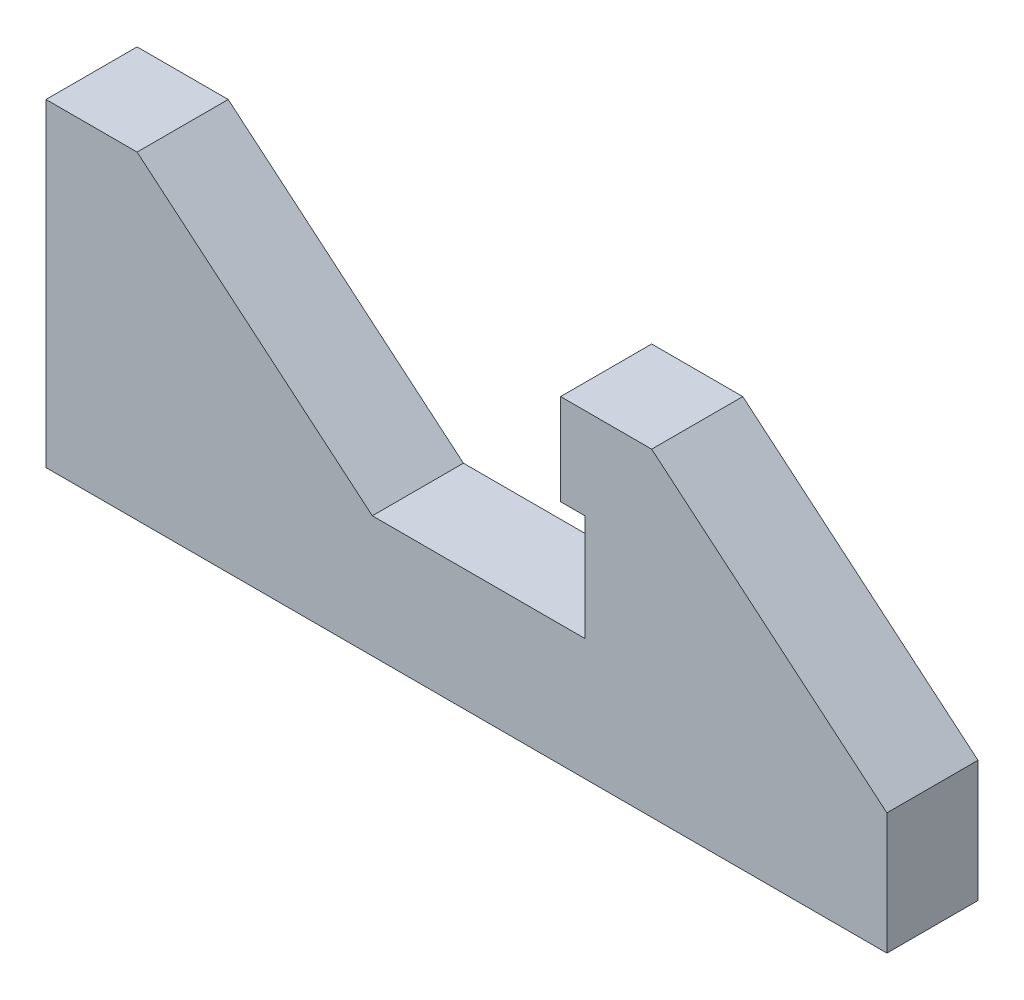
ISO-10303-21;
HEADER;
FILE_DESCRIPTION(('STEP AP214'),'2;1');
FILE_NAME('part.step','',(''),(''),'','','');
FILE_SCHEMA(('AUTOMOTIVE_DESIGN { 1 0 10303 214 1 1 1 1 }'));
ENDSEC;
DATA;
#1=APPLICATION_CONTEXT('core data for automotive mechanical design processes');
#2=APPLICATION_PROTOCOL_DEFINITION('international standard','automotive_design',2000,#1);
#3=PRODUCT_CONTEXT('',#1,'mechanical');
#4=PRODUCT('Part','Part','',(#3));
#5=PRODUCT_RELATED_PRODUCT_CATEGORY('part','',(#4));
#6=PRODUCT_DEFINITION_FORMATION('','',#4);
#7=PRODUCT_DEFINITION_CONTEXT('part definition',#1,'design');
#8=PRODUCT_DEFINITION('design','',#6,#7);
#9=PRODUCT_DEFINITION_SHAPE('','',#8);
#10=(LENGTH_UNIT() NAMED_UNIT(*) SI_UNIT(.MILLI.,.METRE.));
#11=(NAMED_UNIT(*) PLANE_ANGLE_UNIT() SI_UNIT($,.RADIAN.));
#12=(NAMED_UNIT(*) SI_UNIT($,.STERADIAN.) SOLID_ANGLE_UNIT());
#13=UNCERTAINTY_MEASURE_WITH_UNIT(LENGTH_MEASURE(1.E-05),#10,'distance_accuracy_value','');
#14=(GEOMETRIC_REPRESENTATION_CONTEXT(3) GLOBAL_UNCERTAINTY_ASSIGNED_CONTEXT((#13)) GLOBAL_UNIT_ASSIGNED_CONTEXT((#10,
#11,#12)) REPRESENTATION_CONTEXT('',''));
#15=CARTESIAN_POINT('',(0.,0.,0.));
#16=DIRECTION('',(0.,0.,1.));
#17=DIRECTION('',(1.,0.,0.));
#18=AXIS2_PLACEMENT_3D('',#15,#16,#17);
#19=CARTESIAN_POINT('',(276.927967037248,0.,30.));
#20=DIRECTION('',(0.,1.,0.));
#21=DIRECTION('',(-1.,0.,0.));
#22=AXIS2_PLACEMENT_3D('',#19,#20,#21);
#23=PLANE('',#22);
#24=DIRECTION('',(1.,0.,0.));
#25=VECTOR('',#24,1.);
#26=CARTESIAN_POINT('',(276.927967037248,0.,0.));
#27=LINE('',#26,#25);
#28=CARTESIAN_POINT('',(0.,0.,0.));
#29=VERTEX_POINT('',#28);
#30=CARTESIAN_POINT('',(276.927967037248,0.,0.));
#31=VERTEX_POINT('',#30);
#32=EDGE_CURVE('E147',#29,#31,#27,.T.);
#33=ORIENTED_EDGE('',*,*,#32,.T.);
#34=DIRECTION('',(0.,0.,-1.));
#35=VECTOR('',#34,1.);
#36=CARTESIAN_POINT('',(276.927967037248,0.,30.));
#37=LINE('',#36,#35);
#38=CARTESIAN_POINT('',(276.927967037248,0.,30.));
#39=VERTEX_POINT('',#38);
#40=EDGE_CURVE('E11',#39,#31,#37,.T.);
#41=ORIENTED_EDGE('',*,*,#40,.F.);
#42=DIRECTION('',(1.,0.,0.));
#43=VECTOR('',#42,1.);
#44=CARTESIAN_POINT('',(276.927967037248,0.,30.));
#45=LINE('',#44,#43);
#46=CARTESIAN_POINT('',(0.,0.,30.));
#47=VERTEX_POINT('',#46);
#48=EDGE_CURVE('E167',#47,#39,#45,.T.);
#49=ORIENTED_EDGE('',*,*,#48,.F.);
#50=DIRECTION('',(0.,0.,-1.));
#51=VECTOR('',#50,1.);
#52=CARTESIAN_POINT('',(0.,0.,30.));
#53=LINE('',#52,#51);
#54=EDGE_CURVE('E143',#47,#29,#53,.T.);
#55=ORIENTED_EDGE('',*,*,#54,.T.);
#56=EDGE_LOOP('',(#33,#41,#49,#55));
#57=FACE_BOUND('',#56,.T.);
#58=ADVANCED_FACE('F33',(#57),#23,.F.);
#59=CARTESIAN_POINT('',(276.927967037248,40.,30.));
#60=DIRECTION('',(-1.,0.,0.));
#61=DIRECTION('',(0.,0.,1.));
#62=AXIS2_PLACEMENT_3D('',#59,#60,#61);
#63=PLANE('',#62);
#64=DIRECTION('',(0.,1.,0.));
#65=VECTOR('',#64,1.);
#66=CARTESIAN_POINT('',(276.927967037248,40.,0.));
#67=LINE('',#66,#65);
#68=CARTESIAN_POINT('',(276.927967037248,40.,0.));
#69=VERTEX_POINT('',#68);
#70=EDGE_CURVE('E150',#31,#69,#67,.T.);
#71=ORIENTED_EDGE('',*,*,#70,.T.);
#72=DIRECTION('',(0.,0.,-1.));
#73=VECTOR('',#72,1.);
#74=CARTESIAN_POINT('',(276.927967037248,40.,30.));
#75=LINE('',#74,#73);
#76=CARTESIAN_POINT('',(276.927967037248,40.,30.));
#77=VERTEX_POINT('',#76);
#78=EDGE_CURVE('E41',#77,#69,#75,.T.);
#79=ORIENTED_EDGE('',*,*,#78,.F.);
#80=DIRECTION('',(0.,1.,0.));
#81=VECTOR('',#80,1.);
#82=CARTESIAN_POINT('',(276.927967037248,40.,30.));
#83=LINE('',#82,#81);
#84=EDGE_CURVE('E101',#39,#77,#83,.T.);
#85=ORIENTED_EDGE('',*,*,#84,.F.);
#86=ORIENTED_EDGE('',*,*,#40,.T.);
#87=EDGE_LOOP('',(#71,#79,#85,#86));
#88=FACE_BOUND('',#87,.T.);
#89=ADVANCED_FACE('F239',(#88),#63,.F.);
#90=CARTESIAN_POINT('',(199.463983518624,105.,30.));
#91=DIRECTION('',(-0.642787609686538,-0.766044443118979,0.));
#92=DIRECTION('',(0.766044443118979,-0.642787609686538,0.));
#93=AXIS2_PLACEMENT_3D('',#90,#91,#92);
#94=PLANE('',#93);
#95=DIRECTION('',(-0.766044443118979,0.642787609686538,0.));
#96=VECTOR('',#95,1.);
#97=CARTESIAN_POINT('',(199.463983518624,105.,0.));
#98=LINE('',#97,#96);
#99=CARTESIAN_POINT('',(199.463983518624,105.,0.));
#100=VERTEX_POINT('',#99);
#101=EDGE_CURVE('E152',#69,#100,#98,.T.);
#102=ORIENTED_EDGE('',*,*,#101,.T.);
#103=DIRECTION('',(0.,0.,-1.));
#104=VECTOR('',#103,1.);
#105=CARTESIAN_POINT('',(199.463983518624,105.,30.));
#106=LINE('',#105,#104);
#107=CARTESIAN_POINT('',(199.463983518624,105.,30.));
#108=VERTEX_POINT('',#107);
#109=EDGE_CURVE('E183',#108,#100,#106,.T.);
#110=ORIENTED_EDGE('',*,*,#109,.F.);
#111=DIRECTION('',(-0.766044443118979,0.642787609686538,0.));
#112=VECTOR('',#111,1.);
#113=CARTESIAN_POINT('',(199.463983518624,105.,30.));
#114=LINE('',#113,#112);
#115=EDGE_CURVE('E191',#77,#108,#114,.T.);
#116=ORIENTED_EDGE('',*,*,#115,.F.);
#117=ORIENTED_EDGE('',*,*,#78,.T.);
#118=EDGE_LOOP('',(#102,#110,#116,#117));
#119=FACE_BOUND('',#118,.T.);
#120=ADVANCED_FACE('F189',(#119),#94,.F.);
#121=CARTESIAN_POINT('',(169.463983518624,105.,30.));
#122=DIRECTION('',(0.,-1.,0.));
#123=DIRECTION('',(1.,0.,0.));
#124=AXIS2_PLACEMENT_3D('',#121,#122,#123);
#125=PLANE('',#124);
#126=DIRECTION('',(-1.,0.,0.));
#127=VECTOR('',#126,1.);
#128=CARTESIAN_POINT('',(169.463983518624,105.,0.));
#129=LINE('',#128,#127);
#130=CARTESIAN_POINT('',(169.463983518624,105.,0.));
#131=VERTEX_POINT('',#130);
#132=EDGE_CURVE('E154',#100,#131,#129,.T.);
#133=ORIENTED_EDGE('',*,*,#132,.T.);
#134=DIRECTION('',(0.,0.,-1.));
#135=VECTOR('',#134,1.);
#136=CARTESIAN_POINT('',(169.463983518624,105.,30.));
#137=LINE('',#136,#135);
#138=CARTESIAN_POINT('',(169.463983518624,105.,30.));
#139=VERTEX_POINT('',#138);
#140=EDGE_CURVE('E180',#139,#131,#137,.T.);
#141=ORIENTED_EDGE('',*,*,#140,.F.);
#142=DIRECTION('',(-1.,0.,0.));
#143=VECTOR('',#142,1.);
#144=CARTESIAN_POINT('',(169.463983518624,105.,30.));
#145=LINE('',#144,#143);
#146=EDGE_CURVE('E209',#108,#139,#145,.T.);
#147=ORIENTED_EDGE('',*,*,#146,.F.);
#148=ORIENTED_EDGE('',*,*,#109,.T.);
#149=EDGE_LOOP('',(#133,#141,#147,#148));
#150=FACE_BOUND('',#149,.T.);
#151=ADVANCED_FACE('F200',(#150),#125,.F.);
#152=CARTESIAN_POINT('',(169.463983518624,75.,30.));
#153=DIRECTION('',(1.,0.,0.));
#154=DIRECTION('',(0.,1.,0.));
#155=AXIS2_PLACEMENT_3D('',#152,#153,#154);
#156=PLANE('',#155);
#157=DIRECTION('',(0.,-1.,0.));
#158=VECTOR('',#157,1.);
#159=CARTESIAN_POINT('',(169.463983518624,75.,0.));
#160=LINE('',#159,#158);
#161=CARTESIAN_POINT('',(169.463983518624,75.,0.));
#162=VERTEX_POINT('',#161);
#163=EDGE_CURVE('E156',#131,#162,#160,.T.);
#164=ORIENTED_EDGE('',*,*,#163,.T.);
#165=DIRECTION('',(0.,0.,-1.));
#166=VECTOR('',#165,1.);
#167=CARTESIAN_POINT('',(169.463983518624,75.,30.));
#168=LINE('',#167,#166);
#169=CARTESIAN_POINT('',(169.463983518624,75.,30.));
#170=VERTEX_POINT('',#169);
#171=EDGE_CURVE('E177',#170,#162,#168,.T.);
#172=ORIENTED_EDGE('',*,*,#171,.F.);
#173=DIRECTION('',(0.,-1.,0.));
#174=VECTOR('',#173,1.);
#175=CARTESIAN_POINT('',(169.463983518624,75.,30.));
#176=LINE('',#175,#174);
#177=EDGE_CURVE('E206',#139,#170,#176,.T.);
#178=ORIENTED_EDGE('',*,*,#177,.F.);
#179=ORIENTED_EDGE('',*,*,#140,.T.);
#180=EDGE_LOOP('',(#164,#172,#178,#179));
#181=FACE_BOUND('',#180,.T.);
#182=ADVANCED_FACE('F204',(#181),#156,.F.);
#183=CARTESIAN_POINT('',(177.463983518624,75.,30.));
#184=DIRECTION('',(0.,1.,0.));
#185=DIRECTION('',(-1.,0.,0.));
#186=AXIS2_PLACEMENT_3D('',#183,#184,#185);
#187=PLANE('',#186);
#188=DIRECTION('',(1.,0.,0.));
#189=VECTOR('',#188,1.);
#190=CARTESIAN_POINT('',(177.463983518624,75.,0.));
#191=LINE('',#190,#189);
#192=CARTESIAN_POINT('',(177.463983518624,75.,0.));
#193=VERTEX_POINT('',#192);
#194=EDGE_CURVE('E158',#162,#193,#191,.T.);
#195=ORIENTED_EDGE('',*,*,#194,.T.);
#196=DIRECTION('',(0.,0.,-1.));
#197=VECTOR('',#196,1.);
#198=CARTESIAN_POINT('',(177.463983518624,75.,30.));
#199=LINE('',#198,#197);
#200=CARTESIAN_POINT('',(177.463983518624,75.,30.));
#201=VERTEX_POINT('',#200);
#202=EDGE_CURVE('E174',#201,#193,#199,.T.);
#203=ORIENTED_EDGE('',*,*,#202,.F.);
#204=DIRECTION('',(1.,0.,0.));
#205=VECTOR('',#204,1.);
#206=CARTESIAN_POINT('',(177.463983518624,75.,30.));
#207=LINE('',#206,#205);
#208=EDGE_CURVE('E208',#170,#201,#207,.T.);
#209=ORIENTED_EDGE('',*,*,#208,.F.);
#210=ORIENTED_EDGE('',*,*,#171,.T.);
#211=EDGE_LOOP('',(#195,#203,#209,#210));
#212=FACE_BOUND('',#211,.T.);
#213=ADVANCED_FACE('F252',(#212),#187,.F.);
#214=CARTESIAN_POINT('',(177.463983518624,40.,30.));
#215=DIRECTION('',(1.,0.,0.));
#216=DIRECTION('',(0.,1.,0.));
#217=AXIS2_PLACEMENT_3D('',#214,#215,#216);
#218=PLANE('',#217);
#219=DIRECTION('',(0.,-1.,0.));
#220=VECTOR('',#219,1.);
#221=CARTESIAN_POINT('',(177.463983518624,40.,0.));
#222=LINE('',#221,#220);
#223=CARTESIAN_POINT('',(177.463983518624,40.,0.));
#224=VERTEX_POINT('',#223);
#225=EDGE_CURVE('E160',#193,#224,#222,.T.);
#226=ORIENTED_EDGE('',*,*,#225,.T.);
#227=DIRECTION('',(0.,0.,-1.));
#228=VECTOR('',#227,1.);
#229=CARTESIAN_POINT('',(177.463983518624,40.,30.));
#230=LINE('',#229,#228);
#231=CARTESIAN_POINT('',(177.463983518624,40.,30.));
#232=VERTEX_POINT('',#231);
#233=EDGE_CURVE('E171',#232,#224,#230,.T.);
#234=ORIENTED_EDGE('',*,*,#233,.F.);
#235=DIRECTION('',(0.,-1.,0.));
#236=VECTOR('',#235,1.);
#237=CARTESIAN_POINT('',(177.463983518624,40.,30.));
#238=LINE('',#237,#236);
#239=EDGE_CURVE('E211',#201,#232,#238,.T.);
#240=ORIENTED_EDGE('',*,*,#239,.F.);
#241=ORIENTED_EDGE('',*,*,#202,.T.);
#242=EDGE_LOOP('',(#226,#234,#240,#241));
#243=FACE_BOUND('',#242,.T.);
#244=ADVANCED_FACE('F220',(#243),#218,.F.);
#245=CARTESIAN_POINT('',(107.463983518624,40.,30.));
#246=DIRECTION('',(0.,-1.,0.));
#247=DIRECTION('',(1.,0.,0.));
#248=AXIS2_PLACEMENT_3D('',#245,#246,#247);
#249=PLANE('',#248);
#250=DIRECTION('',(-1.,0.,0.));
#251=VECTOR('',#250,1.);
#252=CARTESIAN_POINT('',(107.463983518624,40.,0.));
#253=LINE('',#252,#251);
#254=CARTESIAN_POINT('',(107.463983518624,40.,0.));
#255=VERTEX_POINT('',#254);
#256=EDGE_CURVE('E162',#224,#255,#253,.T.);
#257=ORIENTED_EDGE('',*,*,#256,.T.);
#258=DIRECTION('',(0.,0.,-1.));
#259=VECTOR('',#258,1.);
#260=CARTESIAN_POINT('',(107.463983518624,40.,30.));
#261=LINE('',#260,#259);
#262=CARTESIAN_POINT('',(107.463983518624,40.,30.));
#263=VERTEX_POINT('',#262);
#264=EDGE_CURVE('E138',#263,#255,#261,.T.);
#265=ORIENTED_EDGE('',*,*,#264,.F.);
#266=DIRECTION('',(-1.,0.,0.));
#267=VECTOR('',#266,1.);
#268=CARTESIAN_POINT('',(107.463983518624,40.,30.));
#269=LINE('',#268,#267);
#270=EDGE_CURVE('E129',#232,#263,#269,.T.);
#271=ORIENTED_EDGE('',*,*,#270,.F.);
#272=ORIENTED_EDGE('',*,*,#233,.T.);
#273=EDGE_LOOP('',(#257,#265,#271,#272));
#274=FACE_BOUND('',#273,.T.);
#275=ADVANCED_FACE('F224',(#274),#249,.F.);
#276=CARTESIAN_POINT('',(30.,105.,30.));
#277=DIRECTION('',(-0.642787609686538,-0.766044443118979,0.));
#278=DIRECTION('',(0.766044443118979,-0.642787609686538,0.));
#279=AXIS2_PLACEMENT_3D('',#276,#277,#278);
#280=PLANE('',#279);
#281=DIRECTION('',(-0.766044443118979,0.642787609686538,0.));
#282=VECTOR('',#281,1.);
#283=CARTESIAN_POINT('',(30.,105.,0.));
#284=LINE('',#283,#282);
#285=CARTESIAN_POINT('',(30.,105.,0.));
#286=VERTEX_POINT('',#285);
#287=EDGE_CURVE('E137',#255,#286,#284,.T.);
#288=ORIENTED_EDGE('',*,*,#287,.T.);
#289=DIRECTION('',(0.,0.,-1.));
#290=VECTOR('',#289,1.);
#291=CARTESIAN_POINT('',(30.,105.,30.));
#292=LINE('',#291,#290);
#293=CARTESIAN_POINT('',(30.,105.,30.));
#294=VERTEX_POINT('',#293);
#295=EDGE_CURVE('E134',#294,#286,#292,.T.);
#296=ORIENTED_EDGE('',*,*,#295,.F.);
#297=DIRECTION('',(-0.766044443118979,0.642787609686538,0.));
#298=VECTOR('',#297,1.);
#299=CARTESIAN_POINT('',(30.,105.,30.));
#300=LINE('',#299,#298);
#301=EDGE_CURVE('E123',#263,#294,#300,.T.);
#302=ORIENTED_EDGE('',*,*,#301,.F.);
#303=ORIENTED_EDGE('',*,*,#264,.T.);
#304=EDGE_LOOP('',(#288,#296,#302,#303));
#305=FACE_BOUND('',#304,.T.);
#306=ADVANCED_FACE('F135',(#305),#280,.F.);
#307=CARTESIAN_POINT('',(0.,105.,30.));
#308=DIRECTION('',(0.,-1.,0.));
#309=DIRECTION('',(1.,0.,0.));
#310=AXIS2_PLACEMENT_3D('',#307,#308,#309);
#311=PLANE('',#310);
#312=DIRECTION('',(-1.,0.,0.));
#313=VECTOR('',#312,1.);
#314=CARTESIAN_POINT('',(0.,105.,0.));
#315=LINE('',#314,#313);
#316=CARTESIAN_POINT('',(0.,105.,0.));
#317=VERTEX_POINT('',#316);
#318=EDGE_CURVE('E87',#286,#317,#315,.T.);
#319=ORIENTED_EDGE('',*,*,#318,.T.);
#320=DIRECTION('',(0.,0.,-1.));
#321=VECTOR('',#320,1.);
#322=CARTESIAN_POINT('',(0.,105.,30.));
#323=LINE('',#322,#321);
#324=CARTESIAN_POINT('',(0.,105.,30.));
#325=VERTEX_POINT('',#324);
#326=EDGE_CURVE('E139',#325,#317,#323,.T.);
#327=ORIENTED_EDGE('',*,*,#326,.F.);
#328=DIRECTION('',(-1.,0.,0.));
#329=VECTOR('',#328,1.);
#330=CARTESIAN_POINT('',(0.,105.,30.));
#331=LINE('',#330,#329);
#332=EDGE_CURVE('E127',#294,#325,#331,.T.);
#333=ORIENTED_EDGE('',*,*,#332,.F.);
#334=ORIENTED_EDGE('',*,*,#295,.T.);
#335=EDGE_LOOP('',(#319,#327,#333,#334));
#336=FACE_BOUND('',#335,.T.);
#337=ADVANCED_FACE('F141',(#336),#311,.F.);
#338=CARTESIAN_POINT('',(0.,0.,30.));
#339=DIRECTION('',(1.,0.,0.));
#340=DIRECTION('',(0.,0.,-1.));
#341=AXIS2_PLACEMENT_3D('',#338,#339,#340);
#342=PLANE('',#341);
#343=DIRECTION('',(0.,-1.,0.));
#344=VECTOR('',#343,1.);
#345=CARTESIAN_POINT('',(0.,0.,0.));
#346=LINE('',#345,#344);
#347=EDGE_CURVE('E93',#317,#29,#346,.T.);
#348=ORIENTED_EDGE('',*,*,#347,.T.);
#349=ORIENTED_EDGE('',*,*,#54,.F.);
#350=DIRECTION('',(0.,-1.,0.));
#351=VECTOR('',#350,1.);
#352=CARTESIAN_POINT('',(0.,0.,30.));
#353=LINE('',#352,#351);
#354=EDGE_CURVE('E49',#325,#47,#353,.T.);
#355=ORIENTED_EDGE('',*,*,#354,.F.);
#356=ORIENTED_EDGE('',*,*,#326,.T.);
#357=EDGE_LOOP('',(#348,#349,#355,#356));
#358=FACE_BOUND('',#357,.T.);
#359=ADVANCED_FACE('F228',(#358),#342,.F.);
#360=CARTESIAN_POINT('',(0.,0.,30.));
#361=DIRECTION('',(0.,0.,-1.));
#362=DIRECTION('',(-1.,0.,0.));
#363=AXIS2_PLACEMENT_3D('',#360,#361,#362);
#364=PLANE('',#363);
#365=ORIENTED_EDGE('',*,*,#48,.T.);
#366=ORIENTED_EDGE('',*,*,#84,.T.);
#367=ORIENTED_EDGE('',*,*,#115,.T.);
#368=ORIENTED_EDGE('',*,*,#146,.T.);
#369=ORIENTED_EDGE('',*,*,#177,.T.);
#370=ORIENTED_EDGE('',*,*,#208,.T.);
#371=ORIENTED_EDGE('',*,*,#239,.T.);
#372=ORIENTED_EDGE('',*,*,#270,.T.);
#373=ORIENTED_EDGE('',*,*,#301,.T.);
#374=ORIENTED_EDGE('',*,*,#332,.T.);
#375=ORIENTED_EDGE('',*,*,#354,.T.);
#376=EDGE_LOOP('',(#365,#366,#367,#368,#369,#370,#371,#372,#373,#374,#375));
#377=FACE_BOUND('',#376,.T.);
#378=ADVANCED_FACE('F125',(#377),#364,.F.);
#379=CARTESIAN_POINT('',(0.,0.,0.));
#380=DIRECTION('',(0.,0.,-1.));
#381=DIRECTION('',(-1.,0.,0.));
#382=AXIS2_PLACEMENT_3D('',#379,#380,#381);
#383=PLANE('',#382);
#384=ORIENTED_EDGE('',*,*,#32,.F.);
#385=ORIENTED_EDGE('',*,*,#347,.F.);
#386=ORIENTED_EDGE('',*,*,#318,.F.);
#387=ORIENTED_EDGE('',*,*,#287,.F.);
#388=ORIENTED_EDGE('',*,*,#256,.F.);
#389=ORIENTED_EDGE('',*,*,#225,.F.);
#390=ORIENTED_EDGE('',*,*,#194,.F.);
#391=ORIENTED_EDGE('',*,*,#163,.F.);
#392=ORIENTED_EDGE('',*,*,#132,.F.);
#393=ORIENTED_EDGE('',*,*,#101,.F.);
#394=ORIENTED_EDGE('',*,*,#70,.F.);
#395=EDGE_LOOP('',(#384,#385,#386,#387,#388,#389,#390,#391,#392,#393,#394));
#396=FACE_BOUND('',#395,.T.);
#397=ADVANCED_FACE('F195',(#396),#383,.T.);
#398=CLOSED_SHELL('',(#58,#89,#120,#151,#182,#213,#244,#275,#306,#337,#359,#378,#397));
#399=MANIFOLD_SOLID_BREP('B2',#398);
#400=ADVANCED_BREP_SHAPE_REPRESENTATION('',(#18,#399),#14);
#401=SHAPE_DEFINITION_REPRESENTATION(#9,#400);
ENDSEC;
END-ISO-10303-21;
